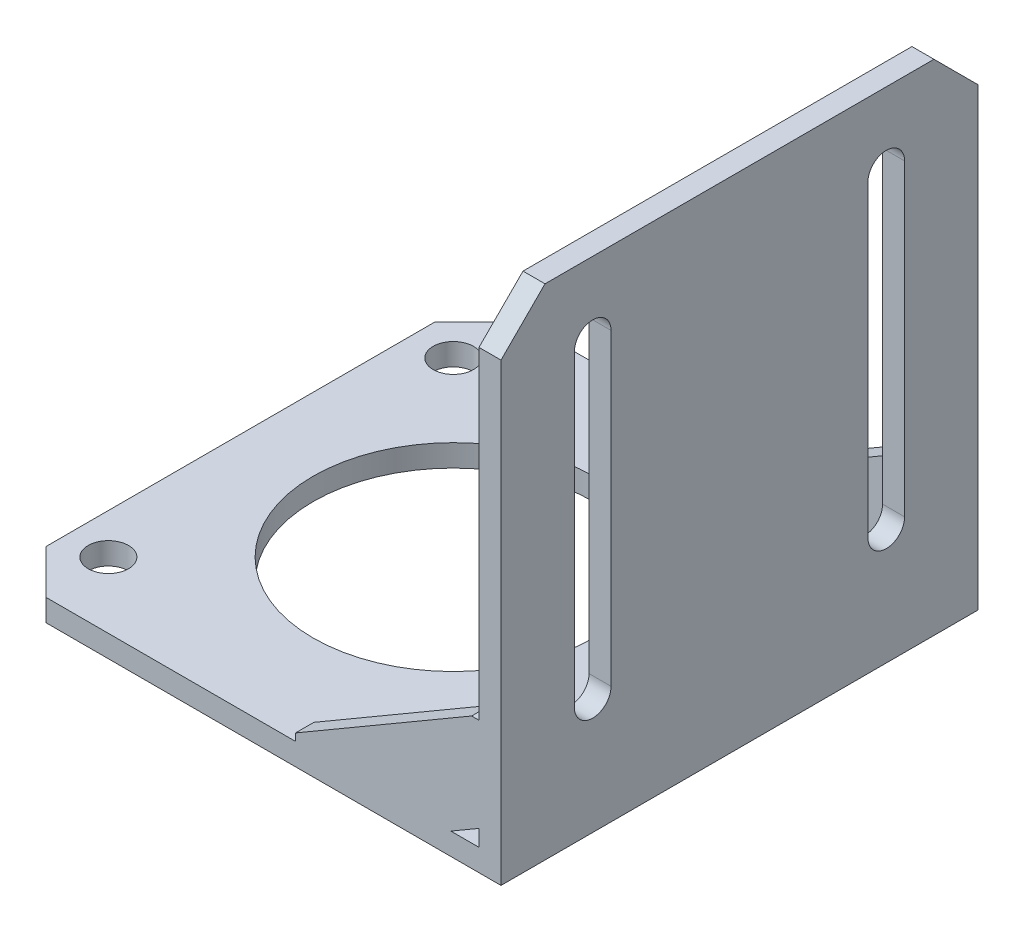
ISO-10303-21;
HEADER;
FILE_DESCRIPTION(('STEP AP214'),'2;1');
FILE_NAME('part.step','',(''),(''),'','','');
FILE_SCHEMA(('AUTOMOTIVE_DESIGN { 1 0 10303 214 1 1 1 1 }'));
ENDSEC;
DATA;
#1=APPLICATION_CONTEXT('core data for automotive mechanical design processes');
#2=APPLICATION_PROTOCOL_DEFINITION('international standard','automotive_design',2000,#1);
#3=PRODUCT_CONTEXT('',#1,'mechanical');
#4=PRODUCT('Part','Part','',(#3));
#5=PRODUCT_RELATED_PRODUCT_CATEGORY('part','',(#4));
#6=PRODUCT_DEFINITION_FORMATION('','',#4);
#7=PRODUCT_DEFINITION_CONTEXT('part definition',#1,'design');
#8=PRODUCT_DEFINITION('design','',#6,#7);
#9=PRODUCT_DEFINITION_SHAPE('','',#8);
#10=(LENGTH_UNIT() NAMED_UNIT(*) SI_UNIT(.MILLI.,.METRE.));
#11=(NAMED_UNIT(*) PLANE_ANGLE_UNIT() SI_UNIT($,.RADIAN.));
#12=(NAMED_UNIT(*) SI_UNIT($,.STERADIAN.) SOLID_ANGLE_UNIT());
#13=UNCERTAINTY_MEASURE_WITH_UNIT(LENGTH_MEASURE(1.E-05),#10,'distance_accuracy_value','');
#14=(GEOMETRIC_REPRESENTATION_CONTEXT(3) GLOBAL_UNCERTAINTY_ASSIGNED_CONTEXT((#13)) GLOBAL_UNIT_ASSIGNED_CONTEXT((#10,
#11,#12)) REPRESENTATION_CONTEXT('',''));
#15=CARTESIAN_POINT('',(0.,0.,0.));
#16=DIRECTION('',(0.,0.,1.));
#17=DIRECTION('',(1.,0.,0.));
#18=AXIS2_PLACEMENT_3D('',#15,#16,#17);
#19=CARTESIAN_POINT('',(-34.,3.,32.5));
#20=DIRECTION('',(1.,0.,0.));
#21=DIRECTION('',(0.,0.,-1.));
#22=AXIS2_PLACEMENT_3D('',#19,#20,#21);
#23=PLANE('',#22);
#24=DIRECTION('',(0.,0.,1.));
#25=VECTOR('',#24,1.);
#26=CARTESIAN_POINT('',(-34.,3.,32.5));
#27=LINE('',#26,#25);
#28=CARTESIAN_POINT('',(-34.,3.,-26.5));
#29=VERTEX_POINT('',#28);
#30=CARTESIAN_POINT('',(-34.,3.,26.5));
#31=VERTEX_POINT('',#30);
#32=EDGE_CURVE('E422',#29,#31,#27,.T.);
#33=ORIENTED_EDGE('',*,*,#32,.F.);
#34=DIRECTION('',(0.,-1.,0.));
#35=VECTOR('',#34,1.);
#36=CARTESIAN_POINT('',(-34.,3.,-26.5));
#37=LINE('',#36,#35);
#38=CARTESIAN_POINT('',(-34.,0.,-26.5));
#39=VERTEX_POINT('',#38);
#40=EDGE_CURVE('E472',#29,#39,#37,.T.);
#41=ORIENTED_EDGE('',*,*,#40,.T.);
#42=DIRECTION('',(0.,0.,1.));
#43=VECTOR('',#42,1.);
#44=CARTESIAN_POINT('',(-34.,0.,32.5));
#45=LINE('',#44,#43);
#46=CARTESIAN_POINT('',(-34.,0.,26.5));
#47=VERTEX_POINT('',#46);
#48=EDGE_CURVE('E421',#39,#47,#45,.T.);
#49=ORIENTED_EDGE('',*,*,#48,.T.);
#50=DIRECTION('',(0.,1.,0.));
#51=VECTOR('',#50,1.);
#52=CARTESIAN_POINT('',(-34.,3.,26.5));
#53=LINE('',#52,#51);
#54=EDGE_CURVE('E470',#47,#31,#53,.T.);
#55=ORIENTED_EDGE('',*,*,#54,.T.);
#56=EDGE_LOOP('',(#33,#41,#49,#55));
#57=FACE_BOUND('',#56,.T.);
#58=ADVANCED_FACE('F35',(#57),#23,.F.);
#59=CARTESIAN_POINT('',(34.,3.,32.5));
#60=DIRECTION('',(0.,0.,-1.));
#61=DIRECTION('',(-1.,0.,0.));
#62=AXIS2_PLACEMENT_3D('',#59,#60,#61);
#63=PLANE('',#62);
#64=DIRECTION('',(1.,0.,0.));
#65=VECTOR('',#64,1.);
#66=CARTESIAN_POINT('',(34.,3.,32.5));
#67=LINE('',#66,#65);
#68=CARTESIAN_POINT('',(27.1713856713857,3.,32.5));
#69=VERTEX_POINT('',#68);
#70=CARTESIAN_POINT('',(31.,3.,32.5));
#71=VERTEX_POINT('',#70);
#72=EDGE_CURVE('E425',#69,#71,#67,.T.);
#73=ORIENTED_EDGE('',*,*,#72,.F.);
#74=DIRECTION('',(0.86377890089843,0.503871025524093,0.));
#75=VECTOR('',#74,1.);
#76=CARTESIAN_POINT('',(31.,5.2333583583584,32.5));
#77=LINE('',#76,#75);
#78=CARTESIAN_POINT('',(31.,5.2333583583584,32.5));
#79=VERTEX_POINT('',#78);
#80=EDGE_CURVE('E276',#69,#79,#77,.T.);
#81=ORIENTED_EDGE('',*,*,#80,.T.);
#82=DIRECTION('',(0.,-1.,0.));
#83=VECTOR('',#82,1.);
#84=CARTESIAN_POINT('',(31.,0.,32.5));
#85=LINE('',#84,#83);
#86=EDGE_CURVE('E412',#79,#71,#85,.T.);
#87=ORIENTED_EDGE('',*,*,#86,.T.);
#88=EDGE_LOOP('',(#73,#81,#87));
#89=FACE_BOUND('',#88,.T.);
#90=DIRECTION('',(0.,-1.,0.));
#91=VECTOR('',#90,1.);
#92=CARTESIAN_POINT('',(34.,3.,32.5));
#93=LINE('',#92,#91);
#94=CARTESIAN_POINT('',(34.,62.,32.5));
#95=VERTEX_POINT('',#94);
#96=CARTESIAN_POINT('',(34.,0.,32.5));
#97=VERTEX_POINT('',#96);
#98=EDGE_CURVE('E443',#95,#97,#93,.T.);
#99=ORIENTED_EDGE('',*,*,#98,.F.);
#100=DIRECTION('',(-1.,0.,0.));
#101=VECTOR('',#100,1.);
#102=CARTESIAN_POINT('',(31.,62.,32.5));
#103=LINE('',#102,#101);
#104=CARTESIAN_POINT('',(31.,62.,32.5));
#105=VERTEX_POINT('',#104);
#106=EDGE_CURVE('E467',#95,#105,#103,.T.);
#107=ORIENTED_EDGE('',*,*,#106,.T.);
#108=CARTESIAN_POINT('',(31.,18.,32.5));
#109=VERTEX_POINT('',#108);
#110=EDGE_CURVE('E409',#105,#109,#85,.T.);
#111=ORIENTED_EDGE('',*,*,#110,.T.);
#112=DIRECTION('',(-1.,0.,0.));
#113=VECTOR('',#112,1.);
#114=CARTESIAN_POINT('',(30.,18.,32.5));
#115=LINE('',#114,#113);
#116=CARTESIAN_POINT('',(30.,18.,32.5));
#117=VERTEX_POINT('',#116);
#118=EDGE_CURVE('E302',#109,#117,#115,.T.);
#119=ORIENTED_EDGE('',*,*,#118,.T.);
#120=DIRECTION('',(-0.863778900898433,-0.503871025524086,0.));
#121=VECTOR('',#120,1.);
#122=CARTESIAN_POINT('',(6.,4.,32.5));
#123=LINE('',#122,#121);
#124=CARTESIAN_POINT('',(6.,4.,32.5));
#125=VERTEX_POINT('',#124);
#126=EDGE_CURVE('E305',#117,#125,#123,.T.);
#127=ORIENTED_EDGE('',*,*,#126,.T.);
#128=DIRECTION('',(0.,-1.,0.));
#129=VECTOR('',#128,1.);
#130=CARTESIAN_POINT('',(6.00000000000001,3.,32.5));
#131=LINE('',#130,#129);
#132=CARTESIAN_POINT('',(6.,3.,32.5));
#133=VERTEX_POINT('',#132);
#134=EDGE_CURVE('E285',#125,#133,#131,.T.);
#135=ORIENTED_EDGE('',*,*,#134,.T.);
#136=CARTESIAN_POINT('',(-28.,3.,32.5));
#137=VERTEX_POINT('',#136);
#138=EDGE_CURVE('E427',#137,#133,#67,.T.);
#139=ORIENTED_EDGE('',*,*,#138,.F.);
#140=DIRECTION('',(0.,-1.,0.));
#141=VECTOR('',#140,1.);
#142=CARTESIAN_POINT('',(-28.,3.,32.5));
#143=LINE('',#142,#141);
#144=CARTESIAN_POINT('',(-28.,0.,32.5));
#145=VERTEX_POINT('',#144);
#146=EDGE_CURVE('E464',#137,#145,#143,.T.);
#147=ORIENTED_EDGE('',*,*,#146,.T.);
#148=DIRECTION('',(1.,0.,0.));
#149=VECTOR('',#148,1.);
#150=CARTESIAN_POINT('',(34.,0.,32.5));
#151=LINE('',#150,#149);
#152=EDGE_CURVE('E435',#145,#97,#151,.T.);
#153=ORIENTED_EDGE('',*,*,#152,.T.);
#154=EDGE_LOOP('',(#99,#107,#111,#119,#127,#135,#139,#147,#153));
#155=FACE_BOUND('',#154,.T.);
#156=ADVANCED_FACE('F497',(#89,#155),#63,.F.);
#157=CARTESIAN_POINT('',(34.,3.,32.5));
#158=DIRECTION('',(-1.,0.,0.));
#159=DIRECTION('',(0.,0.,1.));
#160=AXIS2_PLACEMENT_3D('',#157,#158,#159);
#161=PLANE('',#160);
#162=DIRECTION('',(0.,1.,0.));
#163=VECTOR('',#162,1.);
#164=CARTESIAN_POINT('',(34.,2.99999999999999,-17.5));
#165=LINE('',#164,#163);
#166=CARTESIAN_POINT('',(34.,16.,-17.5));
#167=VERTEX_POINT('',#166);
#168=CARTESIAN_POINT('',(34.,58.,-17.5));
#169=VERTEX_POINT('',#168);
#170=EDGE_CURVE('E383',#167,#169,#165,.T.);
#171=ORIENTED_EDGE('',*,*,#170,.T.);
#172=CARTESIAN_POINT('',(34.,58.,-20.));
#173=DIRECTION('',(-1.,0.,0.));
#174=DIRECTION('',(0.,0.,1.));
#175=AXIS2_PLACEMENT_3D('',#172,#173,#174);
#176=CIRCLE('',#175,2.5);
#177=CARTESIAN_POINT('',(34.,58.,-22.5));
#178=VERTEX_POINT('',#177);
#179=EDGE_CURVE('E386',#169,#178,#176,.T.);
#180=ORIENTED_EDGE('',*,*,#179,.T.);
#181=DIRECTION('',(0.,-1.,0.));
#182=VECTOR('',#181,1.);
#183=CARTESIAN_POINT('',(34.,3.,-22.5));
#184=LINE('',#183,#182);
#185=CARTESIAN_POINT('',(34.,16.,-22.5));
#186=VERTEX_POINT('',#185);
#187=EDGE_CURVE('E377',#178,#186,#184,.T.);
#188=ORIENTED_EDGE('',*,*,#187,.T.);
#189=CARTESIAN_POINT('',(34.,16.,-20.));
#190=DIRECTION('',(-1.,0.,0.));
#191=DIRECTION('',(0.,0.,1.));
#192=AXIS2_PLACEMENT_3D('',#189,#190,#191);
#193=CIRCLE('',#192,2.5);
#194=EDGE_CURVE('E380',#186,#167,#193,.T.);
#195=ORIENTED_EDGE('',*,*,#194,.T.);
#196=EDGE_LOOP('',(#171,#180,#188,#195));
#197=FACE_BOUND('',#196,.T.);
#198=DIRECTION('',(0.,1.,0.));
#199=VECTOR('',#198,1.);
#200=CARTESIAN_POINT('',(34.,3.,22.5));
#201=LINE('',#200,#199);
#202=CARTESIAN_POINT('',(34.,16.,22.5));
#203=VERTEX_POINT('',#202);
#204=CARTESIAN_POINT('',(34.,58.,22.5));
#205=VERTEX_POINT('',#204);
#206=EDGE_CURVE('E371',#203,#205,#201,.T.);
#207=ORIENTED_EDGE('',*,*,#206,.T.);
#208=CARTESIAN_POINT('',(34.,58.,20.));
#209=DIRECTION('',(-1.,0.,0.));
#210=DIRECTION('',(0.,0.,1.));
#211=AXIS2_PLACEMENT_3D('',#208,#209,#210);
#212=CIRCLE('',#211,2.5);
#213=CARTESIAN_POINT('',(34.,58.,17.5));
#214=VERTEX_POINT('',#213);
#215=EDGE_CURVE('E374',#205,#214,#212,.T.);
#216=ORIENTED_EDGE('',*,*,#215,.T.);
#217=DIRECTION('',(0.,-1.,0.));
#218=VECTOR('',#217,1.);
#219=CARTESIAN_POINT('',(34.,3.,17.5));
#220=LINE('',#219,#218);
#221=CARTESIAN_POINT('',(34.,16.,17.5));
#222=VERTEX_POINT('',#221);
#223=EDGE_CURVE('E341',#214,#222,#220,.T.);
#224=ORIENTED_EDGE('',*,*,#223,.T.);
#225=CARTESIAN_POINT('',(34.,16.,20.));
#226=DIRECTION('',(-1.,0.,0.));
#227=DIRECTION('',(0.,0.,1.));
#228=AXIS2_PLACEMENT_3D('',#225,#226,#227);
#229=CIRCLE('',#228,2.5);
#230=EDGE_CURVE('E368',#222,#203,#229,.T.);
#231=ORIENTED_EDGE('',*,*,#230,.T.);
#232=EDGE_LOOP('',(#207,#216,#224,#231));
#233=FACE_BOUND('',#232,.T.);
#234=DIRECTION('',(0.,-1.,0.));
#235=VECTOR('',#234,1.);
#236=CARTESIAN_POINT('',(34.,3.,-32.5));
#237=LINE('',#236,#235);
#238=CARTESIAN_POINT('',(34.,62.,-32.5));
#239=VERTEX_POINT('',#238);
#240=CARTESIAN_POINT('',(34.,0.,-32.5));
#241=VERTEX_POINT('',#240);
#242=EDGE_CURVE('E432',#239,#241,#237,.T.);
#243=ORIENTED_EDGE('',*,*,#242,.F.);
#244=DIRECTION('',(0.,0.707106781186549,0.707106781186546));
#245=VECTOR('',#244,1.);
#246=CARTESIAN_POINT('',(34.,68.,-26.5));
#247=LINE('',#246,#245);
#248=CARTESIAN_POINT('',(34.,68.,-26.5));
#249=VERTEX_POINT('',#248);
#250=EDGE_CURVE('E462',#239,#249,#247,.T.);
#251=ORIENTED_EDGE('',*,*,#250,.T.);
#252=DIRECTION('',(0.,0.,1.));
#253=VECTOR('',#252,1.);
#254=CARTESIAN_POINT('',(34.,68.,-32.5));
#255=LINE('',#254,#253);
#256=CARTESIAN_POINT('',(34.,68.,26.5));
#257=VERTEX_POINT('',#256);
#258=EDGE_CURVE('E407',#249,#257,#255,.T.);
#259=ORIENTED_EDGE('',*,*,#258,.T.);
#260=DIRECTION('',(0.,-0.707106781186545,0.70710678118655));
#261=VECTOR('',#260,1.);
#262=CARTESIAN_POINT('',(34.,62.,32.5));
#263=LINE('',#262,#261);
#264=EDGE_CURVE('E460',#257,#95,#263,.T.);
#265=ORIENTED_EDGE('',*,*,#264,.T.);
#266=ORIENTED_EDGE('',*,*,#98,.T.);
#267=DIRECTION('',(0.,0.,-1.));
#268=VECTOR('',#267,1.);
#269=CARTESIAN_POINT('',(34.,0.,32.5));
#270=LINE('',#269,#268);
#271=EDGE_CURVE('E437',#97,#241,#270,.T.);
#272=ORIENTED_EDGE('',*,*,#271,.T.);
#273=EDGE_LOOP('',(#243,#251,#259,#265,#266,#272));
#274=FACE_BOUND('',#273,.T.);
#275=ADVANCED_FACE('F540',(#197,#233,#274),#161,.F.);
#276=CARTESIAN_POINT('',(34.,3.,-32.5));
#277=DIRECTION('',(0.,0.,1.));
#278=DIRECTION('',(1.,0.,0.));
#279=AXIS2_PLACEMENT_3D('',#276,#277,#278);
#280=PLANE('',#279);
#281=DIRECTION('',(-1.,0.,0.));
#282=VECTOR('',#281,1.);
#283=CARTESIAN_POINT('',(34.,3.,-32.5));
#284=LINE('',#283,#282);
#285=CARTESIAN_POINT('',(5.99999999999999,3.,-32.5));
#286=VERTEX_POINT('',#285);
#287=CARTESIAN_POINT('',(-28.,3.,-32.5));
#288=VERTEX_POINT('',#287);
#289=EDGE_CURVE('E429',#286,#288,#284,.T.);
#290=ORIENTED_EDGE('',*,*,#289,.F.);
#291=DIRECTION('',(0.,1.,0.));
#292=VECTOR('',#291,1.);
#293=CARTESIAN_POINT('',(5.99999999999999,4.,-32.5));
#294=LINE('',#293,#292);
#295=CARTESIAN_POINT('',(5.99999999999999,4.,-32.5));
#296=VERTEX_POINT('',#295);
#297=EDGE_CURVE('E266',#286,#296,#294,.T.);
#298=ORIENTED_EDGE('',*,*,#297,.T.);
#299=DIRECTION('',(0.863778900898433,0.503871025524086,0.));
#300=VECTOR('',#299,1.);
#301=CARTESIAN_POINT('',(30.,18.,-32.5));
#302=LINE('',#301,#300);
#303=CARTESIAN_POINT('',(30.,18.,-32.5));
#304=VERTEX_POINT('',#303);
#305=EDGE_CURVE('E239',#296,#304,#302,.T.);
#306=ORIENTED_EDGE('',*,*,#305,.T.);
#307=DIRECTION('',(1.,0.,0.));
#308=VECTOR('',#307,1.);
#309=CARTESIAN_POINT('',(31.,18.,-32.5));
#310=LINE('',#309,#308);
#311=CARTESIAN_POINT('',(31.,18.,-32.5));
#312=VERTEX_POINT('',#311);
#313=EDGE_CURVE('E269',#304,#312,#310,.T.);
#314=ORIENTED_EDGE('',*,*,#313,.T.);
#315=DIRECTION('',(0.,-1.,0.));
#316=VECTOR('',#315,1.);
#317=CARTESIAN_POINT('',(31.,0.,-32.5));
#318=LINE('',#317,#316);
#319=CARTESIAN_POINT('',(31.,62.,-32.5));
#320=VERTEX_POINT('',#319);
#321=EDGE_CURVE('E405',#320,#312,#318,.T.);
#322=ORIENTED_EDGE('',*,*,#321,.F.);
#323=DIRECTION('',(1.,0.,0.));
#324=VECTOR('',#323,1.);
#325=CARTESIAN_POINT('',(34.,62.,-32.5));
#326=LINE('',#325,#324);
#327=EDGE_CURVE('E458',#320,#239,#326,.T.);
#328=ORIENTED_EDGE('',*,*,#327,.T.);
#329=ORIENTED_EDGE('',*,*,#242,.T.);
#330=DIRECTION('',(-1.,0.,0.));
#331=VECTOR('',#330,1.);
#332=CARTESIAN_POINT('',(34.,0.,-32.5));
#333=LINE('',#332,#331);
#334=CARTESIAN_POINT('',(-28.,0.,-32.5));
#335=VERTEX_POINT('',#334);
#336=EDGE_CURVE('E426',#241,#335,#333,.T.);
#337=ORIENTED_EDGE('',*,*,#336,.T.);
#338=DIRECTION('',(0.,1.,0.));
#339=VECTOR('',#338,1.);
#340=CARTESIAN_POINT('',(-28.,3.,-32.5));
#341=LINE('',#340,#339);
#342=EDGE_CURVE('E455',#335,#288,#341,.T.);
#343=ORIENTED_EDGE('',*,*,#342,.T.);
#344=EDGE_LOOP('',(#290,#298,#306,#314,#322,#328,#329,#337,#343));
#345=FACE_BOUND('',#344,.T.);
#346=DIRECTION('',(-0.86377890089843,-0.503871025524093,0.));
#347=VECTOR('',#346,1.);
#348=CARTESIAN_POINT('',(27.1713856713857,3.,-32.5));
#349=LINE('',#348,#347);
#350=CARTESIAN_POINT('',(31.,5.2333583583584,-32.5));
#351=VERTEX_POINT('',#350);
#352=CARTESIAN_POINT('',(27.1713856713857,3.,-32.5));
#353=VERTEX_POINT('',#352);
#354=EDGE_CURVE('E263',#351,#353,#349,.T.);
#355=ORIENTED_EDGE('',*,*,#354,.T.);
#356=CARTESIAN_POINT('',(31.,3.,-32.5));
#357=VERTEX_POINT('',#356);
#358=EDGE_CURVE('E430',#357,#353,#284,.T.);
#359=ORIENTED_EDGE('',*,*,#358,.F.);
#360=EDGE_CURVE('E408',#351,#357,#318,.T.);
#361=ORIENTED_EDGE('',*,*,#360,.F.);
#362=EDGE_LOOP('',(#355,#359,#361));
#363=FACE_BOUND('',#362,.T.);
#364=ADVANCED_FACE('F509',(#345,#363),#280,.F.);
#365=CARTESIAN_POINT('',(0.,3.,0.));
#366=DIRECTION('',(0.,1.,0.));
#367=DIRECTION('',(0.,0.,1.));
#368=AXIS2_PLACEMENT_3D('',#365,#366,#367);
#369=PLANE('',#368);
#370=DIRECTION('',(0.,0.,-1.));
#371=VECTOR('',#370,1.);
#372=CARTESIAN_POINT('',(5.99999999999999,3.,-30.));
#373=LINE('',#372,#371);
#374=CARTESIAN_POINT('',(5.99999999999999,3.,-30.));
#375=VERTEX_POINT('',#374);
#376=EDGE_CURVE('E245',#375,#286,#373,.T.);
#377=ORIENTED_EDGE('',*,*,#376,.T.);
#378=ORIENTED_EDGE('',*,*,#289,.T.);
#379=DIRECTION('',(0.707106781186548,0.,-0.707106781186547));
#380=VECTOR('',#379,1.);
#381=CARTESIAN_POINT('',(-30.25,3.,-30.25));
#382=LINE('',#381,#380);
#383=EDGE_CURVE('E11',#288,#29,#382,.F.);
#384=ORIENTED_EDGE('',*,*,#383,.T.);
#385=ORIENTED_EDGE('',*,*,#32,.T.);
#386=DIRECTION('',(-0.707106781186547,0.,-0.707106781186548));
#387=VECTOR('',#386,1.);
#388=CARTESIAN_POINT('',(-30.25,3.,30.25));
#389=LINE('',#388,#387);
#390=EDGE_CURVE('E45',#31,#137,#389,.F.);
#391=ORIENTED_EDGE('',*,*,#390,.T.);
#392=ORIENTED_EDGE('',*,*,#138,.T.);
#393=DIRECTION('',(0.,0.,1.));
#394=VECTOR('',#393,1.);
#395=CARTESIAN_POINT('',(6.00000000000001,3.,30.));
#396=LINE('',#395,#394);
#397=CARTESIAN_POINT('',(6.,3.,30.));
#398=VERTEX_POINT('',#397);
#399=EDGE_CURVE('E310',#398,#133,#396,.T.);
#400=ORIENTED_EDGE('',*,*,#399,.F.);
#401=DIRECTION('',(1.,0.,0.));
#402=VECTOR('',#401,1.);
#403=CARTESIAN_POINT('',(27.1713856713857,3.,30.));
#404=LINE('',#403,#402);
#405=CARTESIAN_POINT('',(27.1713856713857,3.,30.));
#406=VERTEX_POINT('',#405);
#407=EDGE_CURVE('E282',#398,#406,#404,.T.);
#408=ORIENTED_EDGE('',*,*,#407,.T.);
#409=DIRECTION('',(0.,0.,1.));
#410=VECTOR('',#409,1.);
#411=CARTESIAN_POINT('',(27.1713856713857,3.,30.));
#412=LINE('',#411,#410);
#413=EDGE_CURVE('E300',#406,#69,#412,.T.);
#414=ORIENTED_EDGE('',*,*,#413,.T.);
#415=ORIENTED_EDGE('',*,*,#72,.T.);
#416=DIRECTION('',(0.,0.,1.));
#417=VECTOR('',#416,1.);
#418=CARTESIAN_POINT('',(31.,3.,0.));
#419=LINE('',#418,#417);
#420=EDGE_CURVE('E416',#357,#71,#419,.T.);
#421=ORIENTED_EDGE('',*,*,#420,.F.);
#422=ORIENTED_EDGE('',*,*,#358,.T.);
#423=DIRECTION('',(0.,0.,-1.));
#424=VECTOR('',#423,1.);
#425=CARTESIAN_POINT('',(27.1713856713857,3.,-30.));
#426=LINE('',#425,#424);
#427=CARTESIAN_POINT('',(27.1713856713857,3.,-30.));
#428=VERTEX_POINT('',#427);
#429=EDGE_CURVE('E53',#428,#353,#426,.T.);
#430=ORIENTED_EDGE('',*,*,#429,.F.);
#431=DIRECTION('',(-1.,0.,0.));
#432=VECTOR('',#431,1.);
#433=CARTESIAN_POINT('',(5.99999999999999,3.,-30.));
#434=LINE('',#433,#432);
#435=EDGE_CURVE('E57',#428,#375,#434,.T.);
#436=ORIENTED_EDGE('',*,*,#435,.T.);
#437=EDGE_LOOP('',(#377,#378,#384,#385,#391,#392,#400,#408,#414,#415,#421,#422,#430,#436));
#438=FACE_BOUND('',#437,.T.);
#439=CARTESIAN_POINT('',(-5.,3.,0.));
#440=DIRECTION('',(0.,1.,0.));
#441=DIRECTION('',(0.,0.,1.));
#442=AXIS2_PLACEMENT_3D('',#439,#440,#441);
#443=CIRCLE('',#442,19.1);
#444=CARTESIAN_POINT('',(-5.,3.,19.1));
#445=VERTEX_POINT('',#444);
#446=EDGE_CURVE('E389',#445,#445,#443,.T.);
#447=ORIENTED_EDGE('',*,*,#446,.F.);
#448=EDGE_LOOP('',(#447));
#449=FACE_BOUND('',#448,.T.);
#450=CARTESIAN_POINT('',(18.5,3.,-23.5));
#451=DIRECTION('',(0.,1.,0.));
#452=DIRECTION('',(0.,0.,1.));
#453=AXIS2_PLACEMENT_3D('',#450,#451,#452);
#454=CIRCLE('',#453,2.75);
#455=CARTESIAN_POINT('',(18.5,3.,-20.75));
#456=VERTEX_POINT('',#455);
#457=EDGE_CURVE('E397',#456,#456,#454,.T.);
#458=ORIENTED_EDGE('',*,*,#457,.F.);
#459=EDGE_LOOP('',(#458));
#460=FACE_BOUND('',#459,.T.);
#461=CARTESIAN_POINT('',(18.6,3.,23.5));
#462=DIRECTION('',(0.,1.,0.));
#463=DIRECTION('',(0.,0.,1.));
#464=AXIS2_PLACEMENT_3D('',#461,#462,#463);
#465=CIRCLE('',#464,2.75);
#466=CARTESIAN_POINT('',(18.6,3.,26.25));
#467=VERTEX_POINT('',#466);
#468=EDGE_CURVE('E394',#467,#467,#465,.T.);
#469=ORIENTED_EDGE('',*,*,#468,.F.);
#470=EDGE_LOOP('',(#469));
#471=FACE_BOUND('',#470,.T.);
#472=CARTESIAN_POINT('',(-28.5,3.,23.5));
#473=DIRECTION('',(0.,1.,0.));
#474=DIRECTION('',(0.,0.,1.));
#475=AXIS2_PLACEMENT_3D('',#472,#473,#474);
#476=CIRCLE('',#475,2.75);
#477=CARTESIAN_POINT('',(-28.5,3.,26.25));
#478=VERTEX_POINT('',#477);
#479=EDGE_CURVE('E390',#478,#478,#476,.T.);
#480=ORIENTED_EDGE('',*,*,#479,.F.);
#481=EDGE_LOOP('',(#480));
#482=FACE_BOUND('',#481,.T.);
#483=CARTESIAN_POINT('',(-28.5,3.,-23.5));
#484=DIRECTION('',(0.,1.,0.));
#485=DIRECTION('',(0.,0.,1.));
#486=AXIS2_PLACEMENT_3D('',#483,#484,#485);
#487=CIRCLE('',#486,2.75);
#488=CARTESIAN_POINT('',(-28.5,3.,-20.75));
#489=VERTEX_POINT('',#488);
#490=EDGE_CURVE('E393',#489,#489,#487,.T.);
#491=ORIENTED_EDGE('',*,*,#490,.F.);
#492=EDGE_LOOP('',(#491));
#493=FACE_BOUND('',#492,.T.);
#494=ADVANCED_FACE('F506',(#438,#449,#460,#471,#482,#493),#369,.T.);
#495=CARTESIAN_POINT('',(0.,0.,0.));
#496=DIRECTION('',(0.,1.,0.));
#497=DIRECTION('',(0.,0.,1.));
#498=AXIS2_PLACEMENT_3D('',#495,#496,#497);
#499=PLANE('',#498);
#500=CARTESIAN_POINT('',(-5.,0.,0.));
#501=DIRECTION('',(0.,1.,0.));
#502=DIRECTION('',(0.,0.,1.));
#503=AXIS2_PLACEMENT_3D('',#500,#501,#502);
#504=CIRCLE('',#503,19.1);
#505=CARTESIAN_POINT('',(-5.,0.,19.1));
#506=VERTEX_POINT('',#505);
#507=EDGE_CURVE('E40',#506,#506,#504,.T.);
#508=ORIENTED_EDGE('',*,*,#507,.T.);
#509=EDGE_LOOP('',(#508));
#510=FACE_BOUND('',#509,.T.);
#511=CARTESIAN_POINT('',(18.5,0.,-23.5));
#512=DIRECTION('',(0.,1.,0.));
#513=DIRECTION('',(0.,0.,1.));
#514=AXIS2_PLACEMENT_3D('',#511,#512,#513);
#515=CIRCLE('',#514,2.75);
#516=CARTESIAN_POINT('',(18.5,0.,-20.75));
#517=VERTEX_POINT('',#516);
#518=EDGE_CURVE('E487',#517,#517,#515,.T.);
#519=ORIENTED_EDGE('',*,*,#518,.T.);
#520=EDGE_LOOP('',(#519));
#521=FACE_BOUND('',#520,.T.);
#522=CARTESIAN_POINT('',(18.6,0.,23.5));
#523=DIRECTION('',(0.,1.,0.));
#524=DIRECTION('',(0.,0.,1.));
#525=AXIS2_PLACEMENT_3D('',#522,#523,#524);
#526=CIRCLE('',#525,2.75);
#527=CARTESIAN_POINT('',(18.6,0.,26.25));
#528=VERTEX_POINT('',#527);
#529=EDGE_CURVE('E485',#528,#528,#526,.T.);
#530=ORIENTED_EDGE('',*,*,#529,.T.);
#531=EDGE_LOOP('',(#530));
#532=FACE_BOUND('',#531,.T.);
#533=CARTESIAN_POINT('',(-28.5,0.,23.5));
#534=DIRECTION('',(0.,1.,0.));
#535=DIRECTION('',(0.,0.,1.));
#536=AXIS2_PLACEMENT_3D('',#533,#534,#535);
#537=CIRCLE('',#536,2.75);
#538=CARTESIAN_POINT('',(-28.5,0.,26.25));
#539=VERTEX_POINT('',#538);
#540=EDGE_CURVE('E482',#539,#539,#537,.T.);
#541=ORIENTED_EDGE('',*,*,#540,.T.);
#542=EDGE_LOOP('',(#541));
#543=FACE_BOUND('',#542,.T.);
#544=CARTESIAN_POINT('',(-28.5,0.,-23.5));
#545=DIRECTION('',(0.,1.,0.));
#546=DIRECTION('',(0.,0.,1.));
#547=AXIS2_PLACEMENT_3D('',#544,#545,#546);
#548=CIRCLE('',#547,2.75);
#549=CARTESIAN_POINT('',(-28.5,0.,-20.75));
#550=VERTEX_POINT('',#549);
#551=EDGE_CURVE('E404',#550,#550,#548,.T.);
#552=ORIENTED_EDGE('',*,*,#551,.T.);
#553=EDGE_LOOP('',(#552));
#554=FACE_BOUND('',#553,.T.);
#555=ORIENTED_EDGE('',*,*,#48,.F.);
#556=DIRECTION('',(-0.707106781186548,0.,0.707106781186547));
#557=VECTOR('',#556,1.);
#558=CARTESIAN_POINT('',(-34.,0.,-26.5));
#559=LINE('',#558,#557);
#560=EDGE_CURVE('E477',#39,#335,#559,.F.);
#561=ORIENTED_EDGE('',*,*,#560,.T.);
#562=ORIENTED_EDGE('',*,*,#336,.F.);
#563=ORIENTED_EDGE('',*,*,#271,.F.);
#564=ORIENTED_EDGE('',*,*,#152,.F.);
#565=DIRECTION('',(0.707106781186547,0.,0.707106781186548));
#566=VECTOR('',#565,1.);
#567=CARTESIAN_POINT('',(-28.,0.,32.5));
#568=LINE('',#567,#566);
#569=EDGE_CURVE('E475',#145,#47,#568,.F.);
#570=ORIENTED_EDGE('',*,*,#569,.T.);
#571=EDGE_LOOP('',(#555,#561,#562,#563,#564,#570));
#572=FACE_BOUND('',#571,.T.);
#573=ADVANCED_FACE('F534',(#510,#521,#532,#543,#554,#572),#499,.F.);
#574=CARTESIAN_POINT('',(31.,0.,-32.5));
#575=DIRECTION('',(-1.,0.,0.));
#576=DIRECTION('',(0.,0.,1.));
#577=AXIS2_PLACEMENT_3D('',#574,#575,#576);
#578=PLANE('',#577);
#579=DIRECTION('',(0.,0.,-1.));
#580=VECTOR('',#579,1.);
#581=CARTESIAN_POINT('',(31.,18.,-30.));
#582=LINE('',#581,#580);
#583=CARTESIAN_POINT('',(31.,18.,-30.));
#584=VERTEX_POINT('',#583);
#585=EDGE_CURVE('E273',#584,#312,#582,.T.);
#586=ORIENTED_EDGE('',*,*,#585,.F.);
#587=DIRECTION('',(0.,-1.,0.));
#588=VECTOR('',#587,1.);
#589=CARTESIAN_POINT('',(31.,5.2333583583584,-30.));
#590=LINE('',#589,#588);
#591=CARTESIAN_POINT('',(31.,5.2333583583584,-30.));
#592=VERTEX_POINT('',#591);
#593=EDGE_CURVE('E272',#584,#592,#590,.T.);
#594=ORIENTED_EDGE('',*,*,#593,.T.);
#595=DIRECTION('',(0.,0.,-1.));
#596=VECTOR('',#595,1.);
#597=CARTESIAN_POINT('',(31.,5.2333583583584,-30.));
#598=LINE('',#597,#596);
#599=EDGE_CURVE('E262',#592,#351,#598,.T.);
#600=ORIENTED_EDGE('',*,*,#599,.T.);
#601=ORIENTED_EDGE('',*,*,#360,.T.);
#602=ORIENTED_EDGE('',*,*,#420,.T.);
#603=ORIENTED_EDGE('',*,*,#86,.F.);
#604=DIRECTION('',(0.,0.,1.));
#605=VECTOR('',#604,1.);
#606=CARTESIAN_POINT('',(31.,5.2333583583584,30.));
#607=LINE('',#606,#605);
#608=CARTESIAN_POINT('',(31.,5.2333583583584,30.));
#609=VERTEX_POINT('',#608);
#610=EDGE_CURVE('E321',#609,#79,#607,.T.);
#611=ORIENTED_EDGE('',*,*,#610,.F.);
#612=DIRECTION('',(0.,1.,0.));
#613=VECTOR('',#612,1.);
#614=CARTESIAN_POINT('',(31.,18.,30.));
#615=LINE('',#614,#613);
#616=CARTESIAN_POINT('',(31.,18.,30.));
#617=VERTEX_POINT('',#616);
#618=EDGE_CURVE('E288',#609,#617,#615,.T.);
#619=ORIENTED_EDGE('',*,*,#618,.T.);
#620=DIRECTION('',(0.,0.,1.));
#621=VECTOR('',#620,1.);
#622=CARTESIAN_POINT('',(31.,18.,30.));
#623=LINE('',#622,#621);
#624=EDGE_CURVE('E318',#617,#109,#623,.T.);
#625=ORIENTED_EDGE('',*,*,#624,.T.);
#626=ORIENTED_EDGE('',*,*,#110,.F.);
#627=DIRECTION('',(0.,0.707106781186545,-0.70710678118655));
#628=VECTOR('',#627,1.);
#629=CARTESIAN_POINT('',(31.,63.5000000000002,30.9999999999998));
#630=LINE('',#629,#628);
#631=CARTESIAN_POINT('',(31.,68.,26.5));
#632=VERTEX_POINT('',#631);
#633=EDGE_CURVE('E451',#105,#632,#630,.T.);
#634=ORIENTED_EDGE('',*,*,#633,.T.);
#635=DIRECTION('',(0.,0.,1.));
#636=VECTOR('',#635,1.);
#637=CARTESIAN_POINT('',(31.,68.,-32.5));
#638=LINE('',#637,#636);
#639=CARTESIAN_POINT('',(31.,68.,-26.5));
#640=VERTEX_POINT('',#639);
#641=EDGE_CURVE('E413',#640,#632,#638,.T.);
#642=ORIENTED_EDGE('',*,*,#641,.F.);
#643=DIRECTION('',(0.,-0.707106781186549,-0.707106781186546));
#644=VECTOR('',#643,1.);
#645=CARTESIAN_POINT('',(31.,30.9999999999999,-63.5));
#646=LINE('',#645,#644);
#647=EDGE_CURVE('E453',#640,#320,#646,.T.);
#648=ORIENTED_EDGE('',*,*,#647,.T.);
#649=ORIENTED_EDGE('',*,*,#321,.T.);
#650=EDGE_LOOP('',(#586,#594,#600,#601,#602,#603,#611,#619,#625,#626,#634,#642,#648,#649));
#651=FACE_BOUND('',#650,.T.);
#652=CARTESIAN_POINT('',(31.,58.,-20.));
#653=DIRECTION('',(-1.,0.,0.));
#654=DIRECTION('',(0.,0.,1.));
#655=AXIS2_PLACEMENT_3D('',#652,#653,#654);
#656=CIRCLE('',#655,2.5);
#657=CARTESIAN_POINT('',(31.,58.,-17.5));
#658=VERTEX_POINT('',#657);
#659=CARTESIAN_POINT('',(31.,58.,-22.5));
#660=VERTEX_POINT('',#659);
#661=EDGE_CURVE('E326',#658,#660,#656,.T.);
#662=ORIENTED_EDGE('',*,*,#661,.F.);
#663=DIRECTION('',(0.,1.,0.));
#664=VECTOR('',#663,1.);
#665=CARTESIAN_POINT('',(31.,58.,-17.5));
#666=LINE('',#665,#664);
#667=CARTESIAN_POINT('',(31.,16.,-17.5));
#668=VERTEX_POINT('',#667);
#669=EDGE_CURVE('E335',#668,#658,#666,.T.);
#670=ORIENTED_EDGE('',*,*,#669,.F.);
#671=CARTESIAN_POINT('',(31.,16.,-20.));
#672=DIRECTION('',(-1.,0.,0.));
#673=DIRECTION('',(0.,0.,1.));
#674=AXIS2_PLACEMENT_3D('',#671,#672,#673);
#675=CIRCLE('',#674,2.5);
#676=CARTESIAN_POINT('',(31.,16.,-22.5));
#677=VERTEX_POINT('',#676);
#678=EDGE_CURVE('E332',#677,#668,#675,.T.);
#679=ORIENTED_EDGE('',*,*,#678,.F.);
#680=DIRECTION('',(0.,-1.,0.));
#681=VECTOR('',#680,1.);
#682=CARTESIAN_POINT('',(31.,58.,-22.5));
#683=LINE('',#682,#681);
#684=EDGE_CURVE('E328',#660,#677,#683,.T.);
#685=ORIENTED_EDGE('',*,*,#684,.F.);
#686=EDGE_LOOP('',(#662,#670,#679,#685));
#687=FACE_BOUND('',#686,.T.);
#688=CARTESIAN_POINT('',(31.,58.,20.));
#689=DIRECTION('',(-1.,0.,0.));
#690=DIRECTION('',(0.,0.,1.));
#691=AXIS2_PLACEMENT_3D('',#688,#689,#690);
#692=CIRCLE('',#691,2.5);
#693=CARTESIAN_POINT('',(31.,58.,22.5));
#694=VERTEX_POINT('',#693);
#695=CARTESIAN_POINT('',(31.,58.,17.5));
#696=VERTEX_POINT('',#695);
#697=EDGE_CURVE('E313',#694,#696,#692,.T.);
#698=ORIENTED_EDGE('',*,*,#697,.F.);
#699=DIRECTION('',(0.,1.,0.));
#700=VECTOR('',#699,1.);
#701=CARTESIAN_POINT('',(31.,58.,22.5));
#702=LINE('',#701,#700);
#703=CARTESIAN_POINT('',(31.,16.,22.5));
#704=VERTEX_POINT('',#703);
#705=EDGE_CURVE('E355',#704,#694,#702,.T.);
#706=ORIENTED_EDGE('',*,*,#705,.F.);
#707=CARTESIAN_POINT('',(31.,16.,20.));
#708=DIRECTION('',(-1.,0.,0.));
#709=DIRECTION('',(0.,0.,1.));
#710=AXIS2_PLACEMENT_3D('',#707,#708,#709);
#711=CIRCLE('',#710,2.5);
#712=CARTESIAN_POINT('',(31.,16.,17.5));
#713=VERTEX_POINT('',#712);
#714=EDGE_CURVE('E352',#713,#704,#711,.T.);
#715=ORIENTED_EDGE('',*,*,#714,.F.);
#716=DIRECTION('',(0.,-1.,0.));
#717=VECTOR('',#716,1.);
#718=CARTESIAN_POINT('',(31.,58.,17.5));
#719=LINE('',#718,#717);
#720=EDGE_CURVE('E349',#696,#713,#719,.T.);
#721=ORIENTED_EDGE('',*,*,#720,.F.);
#722=EDGE_LOOP('',(#698,#706,#715,#721));
#723=FACE_BOUND('',#722,.T.);
#724=ADVANCED_FACE('F503',(#651,#687,#723),#578,.T.);
#725=CARTESIAN_POINT('',(34.,68.,-32.5));
#726=DIRECTION('',(0.,1.,0.));
#727=DIRECTION('',(0.,0.,1.));
#728=AXIS2_PLACEMENT_3D('',#725,#726,#727);
#729=PLANE('',#728);
#730=ORIENTED_EDGE('',*,*,#258,.F.);
#731=DIRECTION('',(-1.,0.,0.));
#732=VECTOR('',#731,1.);
#733=CARTESIAN_POINT('',(31.,68.,-26.5));
#734=LINE('',#733,#732);
#735=EDGE_CURVE('E448',#249,#640,#734,.T.);
#736=ORIENTED_EDGE('',*,*,#735,.T.);
#737=ORIENTED_EDGE('',*,*,#641,.T.);
#738=DIRECTION('',(1.,0.,0.));
#739=VECTOR('',#738,1.);
#740=CARTESIAN_POINT('',(34.,68.,26.5));
#741=LINE('',#740,#739);
#742=EDGE_CURVE('E446',#632,#257,#741,.T.);
#743=ORIENTED_EDGE('',*,*,#742,.T.);
#744=EDGE_LOOP('',(#730,#736,#737,#743));
#745=FACE_BOUND('',#744,.T.);
#746=ADVANCED_FACE('F590',(#745),#729,.T.);
#747=CARTESIAN_POINT('',(34.,68.,-26.5));
#748=DIRECTION('',(0.,0.707106781186546,-0.707106781186549));
#749=DIRECTION('',(1.,0.,0.));
#750=AXIS2_PLACEMENT_3D('',#747,#748,#749);
#751=PLANE('',#750);
#752=ORIENTED_EDGE('',*,*,#250,.F.);
#753=ORIENTED_EDGE('',*,*,#327,.F.);
#754=ORIENTED_EDGE('',*,*,#647,.F.);
#755=ORIENTED_EDGE('',*,*,#735,.F.);
#756=EDGE_LOOP('',(#752,#753,#754,#755));
#757=FACE_BOUND('',#756,.T.);
#758=ADVANCED_FACE('F583',(#757),#751,.T.);
#759=CARTESIAN_POINT('',(34.,62.,32.5));
#760=DIRECTION('',(0.,0.70710678118655,0.707106781186545));
#761=DIRECTION('',(1.,0.,0.));
#762=AXIS2_PLACEMENT_3D('',#759,#760,#761);
#763=PLANE('',#762);
#764=ORIENTED_EDGE('',*,*,#264,.F.);
#765=ORIENTED_EDGE('',*,*,#742,.F.);
#766=ORIENTED_EDGE('',*,*,#633,.F.);
#767=ORIENTED_EDGE('',*,*,#106,.F.);
#768=EDGE_LOOP('',(#764,#765,#766,#767));
#769=FACE_BOUND('',#768,.T.);
#770=ADVANCED_FACE('F589',(#769),#763,.T.);
#771=CARTESIAN_POINT('',(-34.,3.,-26.5));
#772=DIRECTION('',(0.707106781186547,0.,0.707106781186548));
#773=DIRECTION('',(0.,-1.,0.));
#774=AXIS2_PLACEMENT_3D('',#771,#772,#773);
#775=PLANE('',#774);
#776=ORIENTED_EDGE('',*,*,#383,.F.);
#777=ORIENTED_EDGE('',*,*,#342,.F.);
#778=ORIENTED_EDGE('',*,*,#560,.F.);
#779=ORIENTED_EDGE('',*,*,#40,.F.);
#780=EDGE_LOOP('',(#776,#777,#778,#779));
#781=FACE_BOUND('',#780,.T.);
#782=ADVANCED_FACE('F531',(#781),#775,.F.);
#783=CARTESIAN_POINT('',(-28.,3.,32.5));
#784=DIRECTION('',(0.707106781186548,0.,-0.707106781186547));
#785=DIRECTION('',(0.,-1.,0.));
#786=AXIS2_PLACEMENT_3D('',#783,#784,#785);
#787=PLANE('',#786);
#788=ORIENTED_EDGE('',*,*,#390,.F.);
#789=ORIENTED_EDGE('',*,*,#54,.F.);
#790=ORIENTED_EDGE('',*,*,#569,.F.);
#791=ORIENTED_EDGE('',*,*,#146,.F.);
#792=EDGE_LOOP('',(#788,#789,#790,#791));
#793=FACE_BOUND('',#792,.T.);
#794=ADVANCED_FACE('F38',(#793),#787,.F.);
#795=CARTESIAN_POINT('',(-28.5,-62.,-23.5));
#796=DIRECTION('',(0.,1.,0.));
#797=DIRECTION('',(0.,0.,1.));
#798=AXIS2_PLACEMENT_3D('',#795,#796,#797);
#799=CYLINDRICAL_SURFACE('',#798,2.75);
#800=ORIENTED_EDGE('',*,*,#490,.T.);
#801=EDGE_LOOP('',(#800));
#802=FACE_BOUND('',#801,.T.);
#803=ORIENTED_EDGE('',*,*,#551,.F.);
#804=EDGE_LOOP('',(#803));
#805=FACE_BOUND('',#804,.T.);
#806=ADVANCED_FACE('F603',(#802,#805),#799,.F.);
#807=CARTESIAN_POINT('',(-28.5,-62.,23.5));
#808=DIRECTION('',(0.,1.,0.));
#809=DIRECTION('',(0.,0.,1.));
#810=AXIS2_PLACEMENT_3D('',#807,#808,#809);
#811=CYLINDRICAL_SURFACE('',#810,2.75);
#812=ORIENTED_EDGE('',*,*,#479,.T.);
#813=EDGE_LOOP('',(#812));
#814=FACE_BOUND('',#813,.T.);
#815=ORIENTED_EDGE('',*,*,#540,.F.);
#816=EDGE_LOOP('',(#815));
#817=FACE_BOUND('',#816,.T.);
#818=ADVANCED_FACE('F607',(#814,#817),#811,.F.);
#819=CARTESIAN_POINT('',(18.6,-62.,23.5));
#820=DIRECTION('',(0.,1.,0.));
#821=DIRECTION('',(0.,0.,1.));
#822=AXIS2_PLACEMENT_3D('',#819,#820,#821);
#823=CYLINDRICAL_SURFACE('',#822,2.75);
#824=ORIENTED_EDGE('',*,*,#468,.T.);
#825=EDGE_LOOP('',(#824));
#826=FACE_BOUND('',#825,.T.);
#827=ORIENTED_EDGE('',*,*,#529,.F.);
#828=EDGE_LOOP('',(#827));
#829=FACE_BOUND('',#828,.T.);
#830=ADVANCED_FACE('F613',(#826,#829),#823,.F.);
#831=CARTESIAN_POINT('',(18.5,-62.,-23.5));
#832=DIRECTION('',(0.,1.,0.));
#833=DIRECTION('',(0.,0.,1.));
#834=AXIS2_PLACEMENT_3D('',#831,#832,#833);
#835=CYLINDRICAL_SURFACE('',#834,2.75);
#836=ORIENTED_EDGE('',*,*,#457,.T.);
#837=EDGE_LOOP('',(#836));
#838=FACE_BOUND('',#837,.T.);
#839=ORIENTED_EDGE('',*,*,#518,.F.);
#840=EDGE_LOOP('',(#839));
#841=FACE_BOUND('',#840,.T.);
#842=ADVANCED_FACE('F669',(#838,#841),#835,.F.);
#843=CARTESIAN_POINT('',(-5.,-62.,0.));
#844=DIRECTION('',(0.,1.,0.));
#845=DIRECTION('',(0.,0.,1.));
#846=AXIS2_PLACEMENT_3D('',#843,#844,#845);
#847=CYLINDRICAL_SURFACE('',#846,19.1);
#848=ORIENTED_EDGE('',*,*,#446,.T.);
#849=EDGE_LOOP('',(#848));
#850=FACE_BOUND('',#849,.T.);
#851=ORIENTED_EDGE('',*,*,#507,.F.);
#852=EDGE_LOOP('',(#851));
#853=FACE_BOUND('',#852,.T.);
#854=ADVANCED_FACE('F619',(#850,#853),#847,.F.);
#855=CARTESIAN_POINT('',(96.,58.,20.));
#856=DIRECTION('',(-1.,0.,0.));
#857=DIRECTION('',(0.,0.,1.));
#858=AXIS2_PLACEMENT_3D('',#855,#856,#857);
#859=CYLINDRICAL_SURFACE('',#858,2.5);
#860=DIRECTION('',(-1.,0.,0.));
#861=VECTOR('',#860,1.);
#862=CARTESIAN_POINT('',(96.,58.,22.5));
#863=LINE('',#862,#861);
#864=EDGE_CURVE('E329',#205,#694,#863,.T.);
#865=ORIENTED_EDGE('',*,*,#864,.T.);
#866=ORIENTED_EDGE('',*,*,#697,.T.);
#867=DIRECTION('',(-1.,0.,0.));
#868=VECTOR('',#867,1.);
#869=CARTESIAN_POINT('',(96.,58.,17.5));
#870=LINE('',#869,#868);
#871=EDGE_CURVE('E358',#214,#696,#870,.T.);
#872=ORIENTED_EDGE('',*,*,#871,.F.);
#873=ORIENTED_EDGE('',*,*,#215,.F.);
#874=EDGE_LOOP('',(#865,#866,#872,#873));
#875=FACE_BOUND('',#874,.T.);
#876=ADVANCED_FACE('F650',(#875),#859,.F.);
#877=CARTESIAN_POINT('',(96.,58.,22.5));
#878=DIRECTION('',(0.,0.,1.));
#879=DIRECTION('',(0.,-1.,0.));
#880=AXIS2_PLACEMENT_3D('',#877,#878,#879);
#881=PLANE('',#880);
#882=DIRECTION('',(-1.,0.,0.));
#883=VECTOR('',#882,1.);
#884=CARTESIAN_POINT('',(96.,16.,22.5));
#885=LINE('',#884,#883);
#886=EDGE_CURVE('E360',#203,#704,#885,.T.);
#887=ORIENTED_EDGE('',*,*,#886,.T.);
#888=ORIENTED_EDGE('',*,*,#705,.T.);
#889=ORIENTED_EDGE('',*,*,#864,.F.);
#890=ORIENTED_EDGE('',*,*,#206,.F.);
#891=EDGE_LOOP('',(#887,#888,#889,#890));
#892=FACE_BOUND('',#891,.T.);
#893=ADVANCED_FACE('F640',(#892),#881,.F.);
#894=CARTESIAN_POINT('',(96.,16.,20.));
#895=DIRECTION('',(-1.,0.,0.));
#896=DIRECTION('',(0.,0.,1.));
#897=AXIS2_PLACEMENT_3D('',#894,#895,#896);
#898=CYLINDRICAL_SURFACE('',#897,2.5);
#899=DIRECTION('',(-1.,0.,0.));
#900=VECTOR('',#899,1.);
#901=CARTESIAN_POINT('',(96.,16.,17.5));
#902=LINE('',#901,#900);
#903=EDGE_CURVE('E362',#222,#713,#902,.T.);
#904=ORIENTED_EDGE('',*,*,#903,.T.);
#905=ORIENTED_EDGE('',*,*,#714,.T.);
#906=ORIENTED_EDGE('',*,*,#886,.F.);
#907=ORIENTED_EDGE('',*,*,#230,.F.);
#908=EDGE_LOOP('',(#904,#905,#906,#907));
#909=FACE_BOUND('',#908,.T.);
#910=ADVANCED_FACE('F642',(#909),#898,.F.);
#911=CARTESIAN_POINT('',(96.,58.,17.5));
#912=DIRECTION('',(0.,0.,-1.));
#913=DIRECTION('',(0.,1.,0.));
#914=AXIS2_PLACEMENT_3D('',#911,#912,#913);
#915=PLANE('',#914);
#916=ORIENTED_EDGE('',*,*,#871,.T.);
#917=ORIENTED_EDGE('',*,*,#720,.T.);
#918=ORIENTED_EDGE('',*,*,#903,.F.);
#919=ORIENTED_EDGE('',*,*,#223,.F.);
#920=EDGE_LOOP('',(#916,#917,#918,#919));
#921=FACE_BOUND('',#920,.T.);
#922=ADVANCED_FACE('F652',(#921),#915,.F.);
#923=CARTESIAN_POINT('',(96.,58.,-20.));
#924=DIRECTION('',(-1.,0.,0.));
#925=DIRECTION('',(0.,0.,1.));
#926=AXIS2_PLACEMENT_3D('',#923,#924,#925);
#927=CYLINDRICAL_SURFACE('',#926,2.5);
#928=DIRECTION('',(-1.,0.,0.));
#929=VECTOR('',#928,1.);
#930=CARTESIAN_POINT('',(96.,58.,-17.5));
#931=LINE('',#930,#929);
#932=EDGE_CURVE('E339',#169,#658,#931,.T.);
#933=ORIENTED_EDGE('',*,*,#932,.T.);
#934=ORIENTED_EDGE('',*,*,#661,.T.);
#935=DIRECTION('',(-1.,0.,0.));
#936=VECTOR('',#935,1.);
#937=CARTESIAN_POINT('',(96.,58.,-22.5));
#938=LINE('',#937,#936);
#939=EDGE_CURVE('E338',#178,#660,#938,.T.);
#940=ORIENTED_EDGE('',*,*,#939,.F.);
#941=ORIENTED_EDGE('',*,*,#179,.F.);
#942=EDGE_LOOP('',(#933,#934,#940,#941));
#943=FACE_BOUND('',#942,.T.);
#944=ADVANCED_FACE('F654',(#943),#927,.F.);
#945=CARTESIAN_POINT('',(96.,58.,-17.5));
#946=DIRECTION('',(0.,0.,1.));
#947=DIRECTION('',(0.,-1.,0.));
#948=AXIS2_PLACEMENT_3D('',#945,#946,#947);
#949=PLANE('',#948);
#950=DIRECTION('',(-1.,0.,0.));
#951=VECTOR('',#950,1.);
#952=CARTESIAN_POINT('',(96.,16.,-17.5));
#953=LINE('',#952,#951);
#954=EDGE_CURVE('E342',#167,#668,#953,.T.);
#955=ORIENTED_EDGE('',*,*,#954,.T.);
#956=ORIENTED_EDGE('',*,*,#669,.T.);
#957=ORIENTED_EDGE('',*,*,#932,.F.);
#958=ORIENTED_EDGE('',*,*,#170,.F.);
#959=EDGE_LOOP('',(#955,#956,#957,#958));
#960=FACE_BOUND('',#959,.T.);
#961=ADVANCED_FACE('F660',(#960),#949,.F.);
#962=CARTESIAN_POINT('',(96.,16.,-20.));
#963=DIRECTION('',(-1.,0.,0.));
#964=DIRECTION('',(0.,0.,1.));
#965=AXIS2_PLACEMENT_3D('',#962,#963,#964);
#966=CYLINDRICAL_SURFACE('',#965,2.5);
#967=DIRECTION('',(-1.,0.,0.));
#968=VECTOR('',#967,1.);
#969=CARTESIAN_POINT('',(96.,16.,-22.5));
#970=LINE('',#969,#968);
#971=EDGE_CURVE('E344',#186,#677,#970,.T.);
#972=ORIENTED_EDGE('',*,*,#971,.T.);
#973=ORIENTED_EDGE('',*,*,#678,.T.);
#974=ORIENTED_EDGE('',*,*,#954,.F.);
#975=ORIENTED_EDGE('',*,*,#194,.F.);
#976=EDGE_LOOP('',(#972,#973,#974,#975));
#977=FACE_BOUND('',#976,.T.);
#978=ADVANCED_FACE('F730',(#977),#966,.F.);
#979=CARTESIAN_POINT('',(96.,58.,-22.5));
#980=DIRECTION('',(0.,0.,-1.));
#981=DIRECTION('',(0.,1.,0.));
#982=AXIS2_PLACEMENT_3D('',#979,#980,#981);
#983=PLANE('',#982);
#984=ORIENTED_EDGE('',*,*,#939,.T.);
#985=ORIENTED_EDGE('',*,*,#684,.T.);
#986=ORIENTED_EDGE('',*,*,#971,.F.);
#987=ORIENTED_EDGE('',*,*,#187,.F.);
#988=EDGE_LOOP('',(#984,#985,#986,#987));
#989=FACE_BOUND('',#988,.T.);
#990=ADVANCED_FACE('F740',(#989),#983,.F.);
#991=CARTESIAN_POINT('',(6.00000000000001,3.,30.));
#992=DIRECTION('',(-1.,0.,0.));
#993=DIRECTION('',(0.,-1.,0.));
#994=AXIS2_PLACEMENT_3D('',#991,#992,#993);
#995=PLANE('',#994);
#996=ORIENTED_EDGE('',*,*,#134,.F.);
#997=DIRECTION('',(0.,0.,1.));
#998=VECTOR('',#997,1.);
#999=CARTESIAN_POINT('',(6.,4.,30.));
#1000=LINE('',#999,#998);
#1001=CARTESIAN_POINT('',(6.,4.,30.));
#1002=VERTEX_POINT('',#1001);
#1003=EDGE_CURVE('E314',#1002,#125,#1000,.T.);
#1004=ORIENTED_EDGE('',*,*,#1003,.F.);
#1005=DIRECTION('',(0.,-1.,0.));
#1006=VECTOR('',#1005,1.);
#1007=CARTESIAN_POINT('',(6.00000000000001,3.,30.));
#1008=LINE('',#1007,#1006);
#1009=EDGE_CURVE('E297',#1002,#398,#1008,.T.);
#1010=ORIENTED_EDGE('',*,*,#1009,.T.);
#1011=ORIENTED_EDGE('',*,*,#399,.T.);
#1012=EDGE_LOOP('',(#996,#1004,#1010,#1011));
#1013=FACE_BOUND('',#1012,.T.);
#1014=ADVANCED_FACE('F550',(#1013),#995,.T.);
#1015=CARTESIAN_POINT('',(6.,4.,30.));
#1016=DIRECTION('',(-0.503871025524086,0.863778900898433,0.));
#1017=DIRECTION('',(-0.863778900898434,-0.503871025524086,0.));
#1018=AXIS2_PLACEMENT_3D('',#1015,#1016,#1017);
#1019=PLANE('',#1018);
#1020=ORIENTED_EDGE('',*,*,#126,.F.);
#1021=DIRECTION('',(0.,0.,1.));
#1022=VECTOR('',#1021,1.);
#1023=CARTESIAN_POINT('',(30.,18.,30.));
#1024=LINE('',#1023,#1022);
#1025=CARTESIAN_POINT('',(30.,18.,30.));
#1026=VERTEX_POINT('',#1025);
#1027=EDGE_CURVE('E316',#1026,#117,#1024,.T.);
#1028=ORIENTED_EDGE('',*,*,#1027,.F.);
#1029=DIRECTION('',(-0.863778900898433,-0.503871025524086,0.));
#1030=VECTOR('',#1029,1.);
#1031=CARTESIAN_POINT('',(6.,4.,30.));
#1032=LINE('',#1031,#1030);
#1033=EDGE_CURVE('E294',#1026,#1002,#1032,.T.);
#1034=ORIENTED_EDGE('',*,*,#1033,.T.);
#1035=ORIENTED_EDGE('',*,*,#1003,.T.);
#1036=EDGE_LOOP('',(#1020,#1028,#1034,#1035));
#1037=FACE_BOUND('',#1036,.T.);
#1038=ADVANCED_FACE('F554',(#1037),#1019,.T.);
#1039=CARTESIAN_POINT('',(30.,18.,30.));
#1040=DIRECTION('',(0.,1.,0.));
#1041=DIRECTION('',(0.,0.,1.));
#1042=AXIS2_PLACEMENT_3D('',#1039,#1040,#1041);
#1043=PLANE('',#1042);
#1044=ORIENTED_EDGE('',*,*,#118,.F.);
#1045=ORIENTED_EDGE('',*,*,#624,.F.);
#1046=DIRECTION('',(-1.,0.,0.));
#1047=VECTOR('',#1046,1.);
#1048=CARTESIAN_POINT('',(30.,18.,30.));
#1049=LINE('',#1048,#1047);
#1050=EDGE_CURVE('E291',#617,#1026,#1049,.T.);
#1051=ORIENTED_EDGE('',*,*,#1050,.T.);
#1052=ORIENTED_EDGE('',*,*,#1027,.T.);
#1053=EDGE_LOOP('',(#1044,#1045,#1051,#1052));
#1054=FACE_BOUND('',#1053,.T.);
#1055=ADVANCED_FACE('F565',(#1054),#1043,.T.);
#1056=CARTESIAN_POINT('',(31.,5.2333583583584,30.));
#1057=DIRECTION('',(0.503871025524093,-0.86377890089843,0.));
#1058=DIRECTION('',(0.86377890089843,0.503871025524093,0.));
#1059=AXIS2_PLACEMENT_3D('',#1056,#1057,#1058);
#1060=PLANE('',#1059);
#1061=ORIENTED_EDGE('',*,*,#80,.F.);
#1062=ORIENTED_EDGE('',*,*,#413,.F.);
#1063=DIRECTION('',(0.86377890089843,0.503871025524093,0.));
#1064=VECTOR('',#1063,1.);
#1065=CARTESIAN_POINT('',(31.,5.2333583583584,30.));
#1066=LINE('',#1065,#1064);
#1067=EDGE_CURVE('E284',#406,#609,#1066,.T.);
#1068=ORIENTED_EDGE('',*,*,#1067,.T.);
#1069=ORIENTED_EDGE('',*,*,#610,.T.);
#1070=EDGE_LOOP('',(#1061,#1062,#1068,#1069));
#1071=FACE_BOUND('',#1070,.T.);
#1072=ADVANCED_FACE('F562',(#1071),#1060,.T.);
#1073=CARTESIAN_POINT('',(0.,0.,30.));
#1074=DIRECTION('',(0.,0.,-1.));
#1075=DIRECTION('',(-1.,0.,0.));
#1076=AXIS2_PLACEMENT_3D('',#1073,#1074,#1075);
#1077=PLANE('',#1076);
#1078=ORIENTED_EDGE('',*,*,#407,.F.);
#1079=ORIENTED_EDGE('',*,*,#1009,.F.);
#1080=ORIENTED_EDGE('',*,*,#1033,.F.);
#1081=ORIENTED_EDGE('',*,*,#1050,.F.);
#1082=ORIENTED_EDGE('',*,*,#618,.F.);
#1083=ORIENTED_EDGE('',*,*,#1067,.F.);
#1084=EDGE_LOOP('',(#1078,#1079,#1080,#1081,#1082,#1083));
#1085=FACE_BOUND('',#1084,.T.);
#1086=ADVANCED_FACE('F558',(#1085),#1077,.T.);
#1087=CARTESIAN_POINT('',(31.,18.,-30.));
#1088=DIRECTION('',(0.,1.,0.));
#1089=DIRECTION('',(0.,0.,1.));
#1090=AXIS2_PLACEMENT_3D('',#1087,#1088,#1089);
#1091=PLANE('',#1090);
#1092=ORIENTED_EDGE('',*,*,#313,.F.);
#1093=DIRECTION('',(0.,0.,-1.));
#1094=VECTOR('',#1093,1.);
#1095=CARTESIAN_POINT('',(30.,18.,-30.));
#1096=LINE('',#1095,#1094);
#1097=CARTESIAN_POINT('',(30.,18.,-30.));
#1098=VERTEX_POINT('',#1097);
#1099=EDGE_CURVE('E244',#1098,#304,#1096,.T.);
#1100=ORIENTED_EDGE('',*,*,#1099,.F.);
#1101=DIRECTION('',(1.,0.,0.));
#1102=VECTOR('',#1101,1.);
#1103=CARTESIAN_POINT('',(31.,18.,-30.));
#1104=LINE('',#1103,#1102);
#1105=EDGE_CURVE('E253',#1098,#584,#1104,.T.);
#1106=ORIENTED_EDGE('',*,*,#1105,.T.);
#1107=ORIENTED_EDGE('',*,*,#585,.T.);
#1108=EDGE_LOOP('',(#1092,#1100,#1106,#1107));
#1109=FACE_BOUND('',#1108,.T.);
#1110=ADVANCED_FACE('F519',(#1109),#1091,.T.);
#1111=CARTESIAN_POINT('',(30.,18.,-30.));
#1112=DIRECTION('',(-0.503871025524086,0.863778900898433,0.));
#1113=DIRECTION('',(-0.863778900898434,-0.503871025524086,0.));
#1114=AXIS2_PLACEMENT_3D('',#1111,#1112,#1113);
#1115=PLANE('',#1114);
#1116=ORIENTED_EDGE('',*,*,#305,.F.);
#1117=DIRECTION('',(0.,0.,-1.));
#1118=VECTOR('',#1117,1.);
#1119=CARTESIAN_POINT('',(5.99999999999999,4.,-30.));
#1120=LINE('',#1119,#1118);
#1121=CARTESIAN_POINT('',(5.99999999999999,4.,-30.));
#1122=VERTEX_POINT('',#1121);
#1123=EDGE_CURVE('E233',#1122,#296,#1120,.T.);
#1124=ORIENTED_EDGE('',*,*,#1123,.F.);
#1125=DIRECTION('',(0.863778900898433,0.503871025524086,0.));
#1126=VECTOR('',#1125,1.);
#1127=CARTESIAN_POINT('',(30.,18.,-30.));
#1128=LINE('',#1127,#1126);
#1129=EDGE_CURVE('E236',#1122,#1098,#1128,.T.);
#1130=ORIENTED_EDGE('',*,*,#1129,.T.);
#1131=ORIENTED_EDGE('',*,*,#1099,.T.);
#1132=EDGE_LOOP('',(#1116,#1124,#1130,#1131));
#1133=FACE_BOUND('',#1132,.T.);
#1134=ADVANCED_FACE('F235',(#1133),#1115,.T.);
#1135=CARTESIAN_POINT('',(5.99999999999999,4.,-30.));
#1136=DIRECTION('',(-1.,0.,0.));
#1137=DIRECTION('',(0.,0.,1.));
#1138=AXIS2_PLACEMENT_3D('',#1135,#1136,#1137);
#1139=PLANE('',#1138);
#1140=ORIENTED_EDGE('',*,*,#297,.F.);
#1141=ORIENTED_EDGE('',*,*,#376,.F.);
#1142=DIRECTION('',(0.,1.,0.));
#1143=VECTOR('',#1142,1.);
#1144=CARTESIAN_POINT('',(5.99999999999999,4.,-30.));
#1145=LINE('',#1144,#1143);
#1146=EDGE_CURVE('E251',#375,#1122,#1145,.T.);
#1147=ORIENTED_EDGE('',*,*,#1146,.T.);
#1148=ORIENTED_EDGE('',*,*,#1123,.T.);
#1149=EDGE_LOOP('',(#1140,#1141,#1147,#1148));
#1150=FACE_BOUND('',#1149,.T.);
#1151=ADVANCED_FACE('F255',(#1150),#1139,.T.);
#1152=CARTESIAN_POINT('',(27.1713856713857,3.,-30.));
#1153=DIRECTION('',(0.503871025524093,-0.86377890089843,0.));
#1154=DIRECTION('',(0.86377890089843,0.503871025524093,0.));
#1155=AXIS2_PLACEMENT_3D('',#1152,#1153,#1154);
#1156=PLANE('',#1155);
#1157=ORIENTED_EDGE('',*,*,#354,.F.);
#1158=ORIENTED_EDGE('',*,*,#599,.F.);
#1159=DIRECTION('',(-0.86377890089843,-0.503871025524093,0.));
#1160=VECTOR('',#1159,1.);
#1161=CARTESIAN_POINT('',(27.1713856713857,3.,-30.));
#1162=LINE('',#1161,#1160);
#1163=EDGE_CURVE('E257',#592,#428,#1162,.T.);
#1164=ORIENTED_EDGE('',*,*,#1163,.T.);
#1165=ORIENTED_EDGE('',*,*,#429,.T.);
#1166=EDGE_LOOP('',(#1157,#1158,#1164,#1165));
#1167=FACE_BOUND('',#1166,.T.);
#1168=ADVANCED_FACE('F513',(#1167),#1156,.T.);
#1169=CARTESIAN_POINT('',(0.,0.,-30.));
#1170=DIRECTION('',(0.,0.,1.));
#1171=DIRECTION('',(1.,0.,0.));
#1172=AXIS2_PLACEMENT_3D('',#1169,#1170,#1171);
#1173=PLANE('',#1172);
#1174=ORIENTED_EDGE('',*,*,#593,.F.);
#1175=ORIENTED_EDGE('',*,*,#1105,.F.);
#1176=ORIENTED_EDGE('',*,*,#1129,.F.);
#1177=ORIENTED_EDGE('',*,*,#1146,.F.);
#1178=ORIENTED_EDGE('',*,*,#435,.F.);
#1179=ORIENTED_EDGE('',*,*,#1163,.F.);
#1180=EDGE_LOOP('',(#1174,#1175,#1176,#1177,#1178,#1179));
#1181=FACE_BOUND('',#1180,.T.);
#1182=ADVANCED_FACE('F250',(#1181),#1173,.T.);
#1183=CLOSED_SHELL('',(#58,#156,#275,#364,#494,#573,#724,#746,#758,#770,#782,#794,#806,#818,
#830,#842,#854,#876,#893,#910,#922,#944,#961,#978,#990,#1014,#1038,#1055,#1072,#1086,#1110,
#1134,#1151,#1168,#1182));
#1184=MANIFOLD_SOLID_BREP('B2',#1183);
#1185=ADVANCED_BREP_SHAPE_REPRESENTATION('',(#18,#1184),#14);
#1186=SHAPE_DEFINITION_REPRESENTATION(#9,#1185);
ENDSEC;
END-ISO-10303-21;
